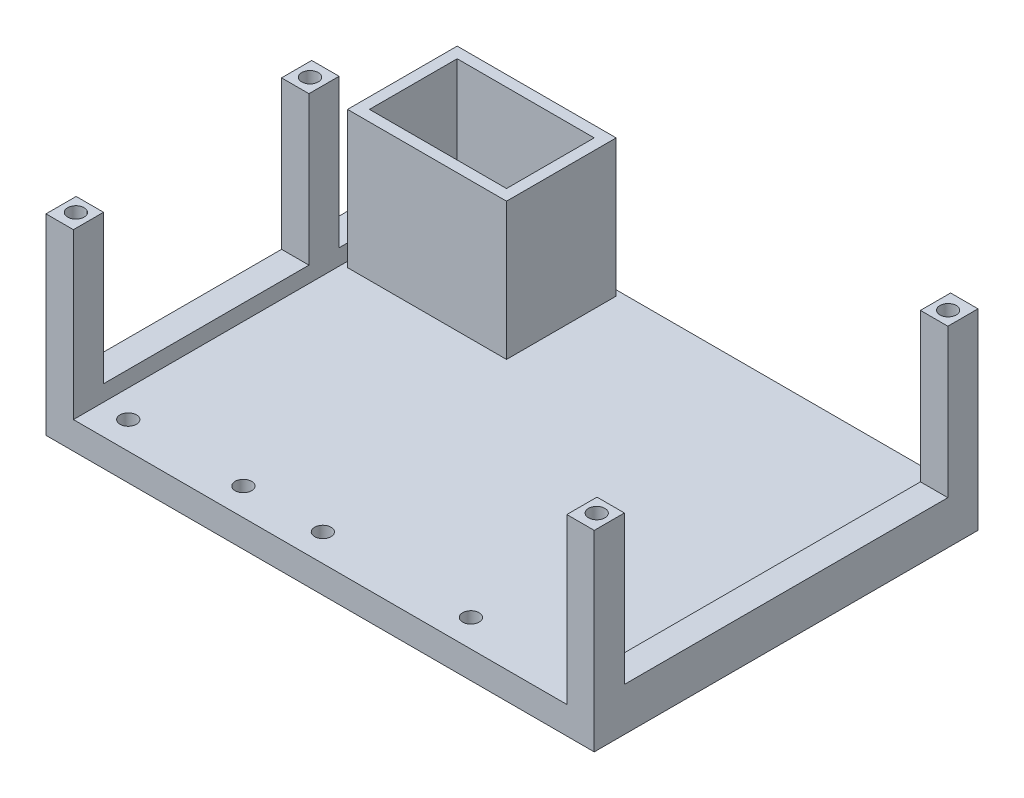
ISO-10303-21;
HEADER;
FILE_DESCRIPTION(('STEP AP214'),'2;1');
FILE_NAME('part.step','',(''),(''),'','','');
FILE_SCHEMA(('AUTOMOTIVE_DESIGN { 1 0 10303 214 1 1 1 1 }'));
ENDSEC;
DATA;
#1=APPLICATION_CONTEXT('core data for automotive mechanical design processes');
#2=APPLICATION_PROTOCOL_DEFINITION('international standard','automotive_design',2000,#1);
#3=PRODUCT_CONTEXT('',#1,'mechanical');
#4=PRODUCT('Part','Part','',(#3));
#5=PRODUCT_RELATED_PRODUCT_CATEGORY('part','',(#4));
#6=PRODUCT_DEFINITION_FORMATION('','',#4);
#7=PRODUCT_DEFINITION_CONTEXT('part definition',#1,'design');
#8=PRODUCT_DEFINITION('design','',#6,#7);
#9=PRODUCT_DEFINITION_SHAPE('','',#8);
#10=(LENGTH_UNIT() NAMED_UNIT(*) SI_UNIT(.MILLI.,.METRE.));
#11=(NAMED_UNIT(*) PLANE_ANGLE_UNIT() SI_UNIT($,.RADIAN.));
#12=(NAMED_UNIT(*) SI_UNIT($,.STERADIAN.) SOLID_ANGLE_UNIT());
#13=UNCERTAINTY_MEASURE_WITH_UNIT(LENGTH_MEASURE(1.E-05),#10,'distance_accuracy_value','');
#14=(GEOMETRIC_REPRESENTATION_CONTEXT(3) GLOBAL_UNCERTAINTY_ASSIGNED_CONTEXT((#13)) GLOBAL_UNIT_ASSIGNED_CONTEXT((#10,
#11,#12)) REPRESENTATION_CONTEXT('',''));
#15=CARTESIAN_POINT('',(0.,0.,0.));
#16=DIRECTION('',(0.,0.,1.));
#17=DIRECTION('',(1.,0.,0.));
#18=AXIS2_PLACEMENT_3D('',#15,#16,#17);
#19=CARTESIAN_POINT('',(0.,32.,0.));
#20=DIRECTION('',(0.,-1.,0.));
#21=DIRECTION('',(0.,0.,-1.));
#22=AXIS2_PLACEMENT_3D('',#19,#20,#21);
#23=PLANE('',#22);
#24=CARTESIAN_POINT('',(-47.5,32.,32.0490066170492));
#25=DIRECTION('',(0.,1.,0.));
#26=DIRECTION('',(0.,0.,1.));
#27=AXIS2_PLACEMENT_3D('',#24,#25,#26);
#28=CIRCLE('',#27,1.5);
#29=CARTESIAN_POINT('',(-47.5,32.,33.5490066170492));
#30=VERTEX_POINT('',#29);
#31=EDGE_CURVE('E380',#30,#30,#28,.T.);
#32=ORIENTED_EDGE('',*,*,#31,.F.);
#33=EDGE_LOOP('',(#32));
#34=FACE_BOUND('',#33,.T.);
#35=DIRECTION('',(0.,0.,-1.));
#36=VECTOR('',#35,1.);
#37=CARTESIAN_POINT('',(-45.,32.,-35.));
#38=LINE('',#37,#36);
#39=CARTESIAN_POINT('',(-45.,32.,35.));
#40=VERTEX_POINT('',#39);
#41=CARTESIAN_POINT('',(-45.,32.,29.5));
#42=VERTEX_POINT('',#41);
#43=EDGE_CURVE('E405',#40,#42,#38,.T.);
#44=ORIENTED_EDGE('',*,*,#43,.T.);
#45=DIRECTION('',(-1.,0.,0.));
#46=VECTOR('',#45,1.);
#47=CARTESIAN_POINT('',(0.,32.,29.5));
#48=LINE('',#47,#46);
#49=CARTESIAN_POINT('',(-50.,32.,29.5));
#50=VERTEX_POINT('',#49);
#51=EDGE_CURVE('E11',#42,#50,#48,.T.);
#52=ORIENTED_EDGE('',*,*,#51,.T.);
#53=DIRECTION('',(0.,0.,1.));
#54=VECTOR('',#53,1.);
#55=CARTESIAN_POINT('',(-50.,32.,-35.));
#56=LINE('',#55,#54);
#57=CARTESIAN_POINT('',(-50.,32.,35.));
#58=VERTEX_POINT('',#57);
#59=EDGE_CURVE('E408',#50,#58,#56,.T.);
#60=ORIENTED_EDGE('',*,*,#59,.T.);
#61=DIRECTION('',(1.,0.,0.));
#62=VECTOR('',#61,1.);
#63=CARTESIAN_POINT('',(-45.,32.,35.));
#64=LINE('',#63,#62);
#65=EDGE_CURVE('E412',#58,#40,#64,.T.);
#66=ORIENTED_EDGE('',*,*,#65,.T.);
#67=EDGE_LOOP('',(#44,#52,#60,#66));
#68=FACE_BOUND('',#67,.T.);
#69=ADVANCED_FACE('F39',(#34,#68),#23,.F.);
#70=CARTESIAN_POINT('',(0.,2.,0.));
#71=DIRECTION('',(0.,1.,0.));
#72=DIRECTION('',(0.,0.,1.));
#73=AXIS2_PLACEMENT_3D('',#70,#71,#72);
#74=PLANE('',#73);
#75=CARTESIAN_POINT('',(-40.,2.,30.));
#76=DIRECTION('',(0.,1.,0.));
#77=DIRECTION('',(0.,0.,1.));
#78=AXIS2_PLACEMENT_3D('',#75,#76,#77);
#79=CIRCLE('',#78,1.5);
#80=CARTESIAN_POINT('',(-40.,2.,31.5));
#81=VERTEX_POINT('',#80);
#82=EDGE_CURVE('E429',#81,#81,#79,.T.);
#83=ORIENTED_EDGE('',*,*,#82,.F.);
#84=EDGE_LOOP('',(#83));
#85=FACE_BOUND('',#84,.T.);
#86=CARTESIAN_POINT('',(-19.,2.,30.));
#87=DIRECTION('',(0.,1.,0.));
#88=DIRECTION('',(0.,0.,1.));
#89=AXIS2_PLACEMENT_3D('',#86,#87,#88);
#90=CIRCLE('',#89,1.5);
#91=CARTESIAN_POINT('',(-19.,2.,31.5));
#92=VERTEX_POINT('',#91);
#93=EDGE_CURVE('E432',#92,#92,#90,.T.);
#94=ORIENTED_EDGE('',*,*,#93,.F.);
#95=EDGE_LOOP('',(#94));
#96=FACE_BOUND('',#95,.T.);
#97=CARTESIAN_POINT('',(-4.49999999999999,2.,30.));
#98=DIRECTION('',(0.,1.,0.));
#99=DIRECTION('',(0.,0.,1.));
#100=AXIS2_PLACEMENT_3D('',#97,#98,#99);
#101=CIRCLE('',#100,1.5);
#102=CARTESIAN_POINT('',(-4.49999999999999,2.,31.5));
#103=VERTEX_POINT('',#102);
#104=EDGE_CURVE('E438',#103,#103,#101,.T.);
#105=ORIENTED_EDGE('',*,*,#104,.F.);
#106=EDGE_LOOP('',(#105));
#107=FACE_BOUND('',#106,.T.);
#108=CARTESIAN_POINT('',(22.5,2.,30.));
#109=DIRECTION('',(0.,1.,0.));
#110=DIRECTION('',(0.,0.,1.));
#111=AXIS2_PLACEMENT_3D('',#108,#109,#110);
#112=CIRCLE('',#111,1.5);
#113=CARTESIAN_POINT('',(22.5,2.,31.5));
#114=VERTEX_POINT('',#113);
#115=EDGE_CURVE('E444',#114,#114,#112,.T.);
#116=ORIENTED_EDGE('',*,*,#115,.F.);
#117=EDGE_LOOP('',(#116));
#118=FACE_BOUND('',#117,.T.);
#119=DIRECTION('',(1.,0.,0.));
#120=VECTOR('',#119,1.);
#121=CARTESIAN_POINT('',(-45.,2.,35.));
#122=LINE('',#121,#120);
#123=CARTESIAN_POINT('',(-45.,2.,35.));
#124=VERTEX_POINT('',#123);
#125=CARTESIAN_POINT('',(45.,2.,35.));
#126=VERTEX_POINT('',#125);
#127=EDGE_CURVE('E452',#124,#126,#122,.T.);
#128=ORIENTED_EDGE('',*,*,#127,.T.);
#129=DIRECTION('',(0.,0.,1.));
#130=VECTOR('',#129,1.);
#131=CARTESIAN_POINT('',(45.,2.,-35.));
#132=LINE('',#131,#130);
#133=CARTESIAN_POINT('',(45.,2.,-35.));
#134=VERTEX_POINT('',#133);
#135=EDGE_CURVE('E383',#134,#126,#132,.T.);
#136=ORIENTED_EDGE('',*,*,#135,.F.);
#137=DIRECTION('',(-1.,0.,0.));
#138=VECTOR('',#137,1.);
#139=CARTESIAN_POINT('',(-45.,2.,-35.));
#140=LINE('',#139,#138);
#141=CARTESIAN_POINT('',(-45.,2.,-35.));
#142=VERTEX_POINT('',#141);
#143=EDGE_CURVE('E225',#134,#142,#140,.T.);
#144=ORIENTED_EDGE('',*,*,#143,.T.);
#145=DIRECTION('',(0.,0.,-1.));
#146=VECTOR('',#145,1.);
#147=CARTESIAN_POINT('',(-45.,2.,-35.));
#148=LINE('',#147,#146);
#149=EDGE_CURVE('E404',#124,#142,#148,.T.);
#150=ORIENTED_EDGE('',*,*,#149,.F.);
#151=EDGE_LOOP('',(#128,#136,#144,#150));
#152=FACE_BOUND('',#151,.T.);
#153=DIRECTION('',(0.,0.,1.));
#154=VECTOR('',#153,1.);
#155=CARTESIAN_POINT('',(-44.,2.,0.));
#156=LINE('',#155,#154);
#157=CARTESIAN_POINT('',(-44.,2.,-34.));
#158=VERTEX_POINT('',#157);
#159=CARTESIAN_POINT('',(-44.,2.,-14.));
#160=VERTEX_POINT('',#159);
#161=EDGE_CURVE('E332',#158,#160,#156,.T.);
#162=ORIENTED_EDGE('',*,*,#161,.F.);
#163=DIRECTION('',(-1.,0.,0.));
#164=VECTOR('',#163,1.);
#165=CARTESIAN_POINT('',(0.,2.,-34.));
#166=LINE('',#165,#164);
#167=CARTESIAN_POINT('',(-15.,2.,-34.));
#168=VERTEX_POINT('',#167);
#169=EDGE_CURVE('E312',#168,#158,#166,.T.);
#170=ORIENTED_EDGE('',*,*,#169,.F.);
#171=DIRECTION('',(0.,0.,-1.));
#172=VECTOR('',#171,1.);
#173=CARTESIAN_POINT('',(-15.,2.,0.));
#174=LINE('',#173,#172);
#175=CARTESIAN_POINT('',(-15.,2.,-14.));
#176=VERTEX_POINT('',#175);
#177=EDGE_CURVE('E323',#176,#168,#174,.T.);
#178=ORIENTED_EDGE('',*,*,#177,.F.);
#179=DIRECTION('',(1.,0.,0.));
#180=VECTOR('',#179,1.);
#181=CARTESIAN_POINT('',(0.,2.,-14.));
#182=LINE('',#181,#180);
#183=EDGE_CURVE('E334',#160,#176,#182,.T.);
#184=ORIENTED_EDGE('',*,*,#183,.F.);
#185=EDGE_LOOP('',(#162,#170,#178,#184));
#186=FACE_BOUND('',#185,.T.);
#187=ADVANCED_FACE('F495',(#85,#96,#107,#118,#152,#186),#74,.T.);
#188=CARTESIAN_POINT('',(50.,0.,-35.));
#189=DIRECTION('',(1.,0.,0.));
#190=DIRECTION('',(0.,0.,-1.));
#191=AXIS2_PLACEMENT_3D('',#188,#189,#190);
#192=PLANE('',#191);
#193=DIRECTION('',(0.,0.,1.));
#194=VECTOR('',#193,1.);
#195=CARTESIAN_POINT('',(50.,4.91267187609612,-35.));
#196=LINE('',#195,#194);
#197=CARTESIAN_POINT('',(50.,4.91267187609612,-29.5));
#198=VERTEX_POINT('',#197);
#199=CARTESIAN_POINT('',(50.,4.91267187609612,29.5));
#200=VERTEX_POINT('',#199);
#201=EDGE_CURVE('E362',#198,#200,#196,.T.);
#202=ORIENTED_EDGE('',*,*,#201,.T.);
#203=DIRECTION('',(0.,1.,0.));
#204=VECTOR('',#203,1.);
#205=CARTESIAN_POINT('',(50.,0.,29.5));
#206=LINE('',#205,#204);
#207=CARTESIAN_POINT('',(50.,32.,29.5));
#208=VERTEX_POINT('',#207);
#209=EDGE_CURVE('E360',#200,#208,#206,.T.);
#210=ORIENTED_EDGE('',*,*,#209,.T.);
#211=DIRECTION('',(0.,0.,-1.));
#212=VECTOR('',#211,1.);
#213=CARTESIAN_POINT('',(50.,32.,-35.));
#214=LINE('',#213,#212);
#215=CARTESIAN_POINT('',(50.,32.,35.));
#216=VERTEX_POINT('',#215);
#217=EDGE_CURVE('E237',#216,#208,#214,.T.);
#218=ORIENTED_EDGE('',*,*,#217,.F.);
#219=DIRECTION('',(0.,1.,0.));
#220=VECTOR('',#219,1.);
#221=CARTESIAN_POINT('',(50.,0.,35.));
#222=LINE('',#221,#220);
#223=CARTESIAN_POINT('',(50.,-3.,35.));
#224=VERTEX_POINT('',#223);
#225=EDGE_CURVE('E216',#224,#216,#222,.T.);
#226=ORIENTED_EDGE('',*,*,#225,.F.);
#227=DIRECTION('',(0.,0.,1.));
#228=VECTOR('',#227,1.);
#229=CARTESIAN_POINT('',(50.,-3.,0.));
#230=LINE('',#229,#228);
#231=CARTESIAN_POINT('',(50.,-3.,-35.));
#232=VERTEX_POINT('',#231);
#233=EDGE_CURVE('E234',#232,#224,#230,.T.);
#234=ORIENTED_EDGE('',*,*,#233,.F.);
#235=DIRECTION('',(0.,1.,0.));
#236=VECTOR('',#235,1.);
#237=CARTESIAN_POINT('',(50.,0.,-35.));
#238=LINE('',#237,#236);
#239=CARTESIAN_POINT('',(50.,32.,-35.));
#240=VERTEX_POINT('',#239);
#241=EDGE_CURVE('E239',#232,#240,#238,.T.);
#242=ORIENTED_EDGE('',*,*,#241,.T.);
#243=CARTESIAN_POINT('',(50.,32.,-29.5));
#244=VERTEX_POINT('',#243);
#245=EDGE_CURVE('E392',#244,#240,#214,.T.);
#246=ORIENTED_EDGE('',*,*,#245,.F.);
#247=DIRECTION('',(0.,-1.,0.));
#248=VECTOR('',#247,1.);
#249=CARTESIAN_POINT('',(50.,0.,-29.5));
#250=LINE('',#249,#248);
#251=EDGE_CURVE('E355',#244,#198,#250,.T.);
#252=ORIENTED_EDGE('',*,*,#251,.T.);
#253=EDGE_LOOP('',(#202,#210,#218,#226,#234,#242,#246,#252));
#254=FACE_BOUND('',#253,.T.);
#255=ADVANCED_FACE('F232',(#254),#192,.T.);
#256=CARTESIAN_POINT('',(45.,32.,-35.));
#257=DIRECTION('',(1.,0.,0.));
#258=DIRECTION('',(0.,0.,-1.));
#259=AXIS2_PLACEMENT_3D('',#256,#257,#258);
#260=PLANE('',#259);
#261=DIRECTION('',(0.,1.,0.));
#262=VECTOR('',#261,1.);
#263=CARTESIAN_POINT('',(45.,32.,29.5));
#264=LINE('',#263,#262);
#265=CARTESIAN_POINT('',(45.,4.91267187609612,29.5));
#266=VERTEX_POINT('',#265);
#267=CARTESIAN_POINT('',(45.,32.,29.5));
#268=VERTEX_POINT('',#267);
#269=EDGE_CURVE('E358',#266,#268,#264,.T.);
#270=ORIENTED_EDGE('',*,*,#269,.F.);
#271=DIRECTION('',(0.,0.,1.));
#272=VECTOR('',#271,1.);
#273=CARTESIAN_POINT('',(45.,4.91267187609612,-35.));
#274=LINE('',#273,#272);
#275=CARTESIAN_POINT('',(45.,4.91267187609612,-29.5));
#276=VERTEX_POINT('',#275);
#277=EDGE_CURVE('E460',#276,#266,#274,.T.);
#278=ORIENTED_EDGE('',*,*,#277,.F.);
#279=DIRECTION('',(0.,-1.,0.));
#280=VECTOR('',#279,1.);
#281=CARTESIAN_POINT('',(45.,32.,-29.5));
#282=LINE('',#281,#280);
#283=CARTESIAN_POINT('',(45.,32.,-29.5));
#284=VERTEX_POINT('',#283);
#285=EDGE_CURVE('E353',#284,#276,#282,.T.);
#286=ORIENTED_EDGE('',*,*,#285,.F.);
#287=DIRECTION('',(0.,0.,1.));
#288=VECTOR('',#287,1.);
#289=CARTESIAN_POINT('',(45.,32.,-35.));
#290=LINE('',#289,#288);
#291=CARTESIAN_POINT('',(45.,32.,-35.));
#292=VERTEX_POINT('',#291);
#293=EDGE_CURVE('E386',#292,#284,#290,.T.);
#294=ORIENTED_EDGE('',*,*,#293,.F.);
#295=DIRECTION('',(0.,-1.,0.));
#296=VECTOR('',#295,1.);
#297=CARTESIAN_POINT('',(45.,32.,-35.));
#298=LINE('',#297,#296);
#299=EDGE_CURVE('E396',#292,#134,#298,.T.);
#300=ORIENTED_EDGE('',*,*,#299,.T.);
#301=ORIENTED_EDGE('',*,*,#135,.T.);
#302=DIRECTION('',(0.,-1.,0.));
#303=VECTOR('',#302,1.);
#304=CARTESIAN_POINT('',(45.,32.,35.));
#305=LINE('',#304,#303);
#306=CARTESIAN_POINT('',(45.,32.,35.));
#307=VERTEX_POINT('',#306);
#308=EDGE_CURVE('E401',#307,#126,#305,.T.);
#309=ORIENTED_EDGE('',*,*,#308,.F.);
#310=EDGE_CURVE('E390',#268,#307,#290,.T.);
#311=ORIENTED_EDGE('',*,*,#310,.F.);
#312=EDGE_LOOP('',(#270,#278,#286,#294,#300,#301,#309,#311));
#313=FACE_BOUND('',#312,.T.);
#314=ADVANCED_FACE('F504',(#313),#260,.F.);
#315=CARTESIAN_POINT('',(0.,32.,0.));
#316=DIRECTION('',(0.,1.,0.));
#317=DIRECTION('',(0.,0.,1.));
#318=AXIS2_PLACEMENT_3D('',#315,#316,#317);
#319=PLANE('',#318);
#320=CARTESIAN_POINT('',(47.5,32.,32.0490066170492));
#321=DIRECTION('',(0.,1.,0.));
#322=DIRECTION('',(0.,0.,-1.));
#323=AXIS2_PLACEMENT_3D('',#320,#321,#322);
#324=CIRCLE('',#323,1.5);
#325=CARTESIAN_POINT('',(47.5,32.,30.5490066170492));
#326=VERTEX_POINT('',#325);
#327=EDGE_CURVE('E364',#326,#326,#324,.T.);
#328=ORIENTED_EDGE('',*,*,#327,.F.);
#329=EDGE_LOOP('',(#328));
#330=FACE_BOUND('',#329,.T.);
#331=ORIENTED_EDGE('',*,*,#217,.T.);
#332=DIRECTION('',(-1.,0.,0.));
#333=VECTOR('',#332,1.);
#334=CARTESIAN_POINT('',(0.,32.,29.5));
#335=LINE('',#334,#333);
#336=EDGE_CURVE('E457',#208,#268,#335,.T.);
#337=ORIENTED_EDGE('',*,*,#336,.T.);
#338=ORIENTED_EDGE('',*,*,#310,.T.);
#339=DIRECTION('',(1.,0.,0.));
#340=VECTOR('',#339,1.);
#341=CARTESIAN_POINT('',(45.,32.,35.));
#342=LINE('',#341,#340);
#343=EDGE_CURVE('E389',#307,#216,#342,.T.);
#344=ORIENTED_EDGE('',*,*,#343,.T.);
#345=EDGE_LOOP('',(#331,#337,#338,#344));
#346=FACE_BOUND('',#345,.T.);
#347=ADVANCED_FACE('F522',(#330,#346),#319,.T.);
#348=CARTESIAN_POINT('',(47.5,32.,-32.0490066170492));
#349=DIRECTION('',(0.,1.,0.));
#350=DIRECTION('',(0.,0.,1.));
#351=AXIS2_PLACEMENT_3D('',#348,#349,#350);
#352=CIRCLE('',#351,1.5);
#353=CARTESIAN_POINT('',(47.5,32.,-30.5490066170492));
#354=VERTEX_POINT('',#353);
#355=EDGE_CURVE('E372',#354,#354,#352,.T.);
#356=ORIENTED_EDGE('',*,*,#355,.F.);
#357=EDGE_LOOP('',(#356));
#358=FACE_BOUND('',#357,.T.);
#359=ORIENTED_EDGE('',*,*,#293,.T.);
#360=DIRECTION('',(1.,0.,0.));
#361=VECTOR('',#360,1.);
#362=CARTESIAN_POINT('',(0.,32.,-29.5));
#363=LINE('',#362,#361);
#364=EDGE_CURVE('E454',#284,#244,#363,.T.);
#365=ORIENTED_EDGE('',*,*,#364,.T.);
#366=ORIENTED_EDGE('',*,*,#245,.T.);
#367=DIRECTION('',(-1.,0.,0.));
#368=VECTOR('',#367,1.);
#369=CARTESIAN_POINT('',(45.,32.,-35.));
#370=LINE('',#369,#368);
#371=EDGE_CURVE('E394',#240,#292,#370,.T.);
#372=ORIENTED_EDGE('',*,*,#371,.T.);
#373=EDGE_LOOP('',(#359,#365,#366,#372));
#374=FACE_BOUND('',#373,.T.);
#375=ADVANCED_FACE('F509',(#358,#374),#319,.T.);
#376=CARTESIAN_POINT('',(-45.,2.,-35.));
#377=DIRECTION('',(0.,0.,1.));
#378=DIRECTION('',(1.,0.,0.));
#379=AXIS2_PLACEMENT_3D('',#376,#377,#378);
#380=PLANE('',#379);
#381=ORIENTED_EDGE('',*,*,#241,.F.);
#382=DIRECTION('',(-1.,0.,0.));
#383=VECTOR('',#382,1.);
#384=CARTESIAN_POINT('',(-45.,-3.,-35.));
#385=LINE('',#384,#383);
#386=CARTESIAN_POINT('',(-50.,-3.,-35.));
#387=VERTEX_POINT('',#386);
#388=EDGE_CURVE('E226',#232,#387,#385,.T.);
#389=ORIENTED_EDGE('',*,*,#388,.T.);
#390=DIRECTION('',(0.,1.,0.));
#391=VECTOR('',#390,1.);
#392=CARTESIAN_POINT('',(-50.,0.,-35.));
#393=LINE('',#392,#391);
#394=CARTESIAN_POINT('',(-50.,4.91267187609611,-35.));
#395=VERTEX_POINT('',#394);
#396=EDGE_CURVE('E238',#387,#395,#393,.T.);
#397=ORIENTED_EDGE('',*,*,#396,.T.);
#398=DIRECTION('',(1.,0.,0.));
#399=VECTOR('',#398,1.);
#400=CARTESIAN_POINT('',(-70.,4.91267187609611,-35.));
#401=LINE('',#400,#399);
#402=CARTESIAN_POINT('',(-45.,4.91267187609611,-35.));
#403=VERTEX_POINT('',#402);
#404=EDGE_CURVE('E261',#395,#403,#401,.T.);
#405=ORIENTED_EDGE('',*,*,#404,.T.);
#406=DIRECTION('',(0.,-1.,0.));
#407=VECTOR('',#406,1.);
#408=CARTESIAN_POINT('',(-45.,32.,-35.));
#409=LINE('',#408,#407);
#410=EDGE_CURVE('E419',#403,#142,#409,.T.);
#411=ORIENTED_EDGE('',*,*,#410,.T.);
#412=ORIENTED_EDGE('',*,*,#143,.F.);
#413=ORIENTED_EDGE('',*,*,#299,.F.);
#414=ORIENTED_EDGE('',*,*,#371,.F.);
#415=EDGE_LOOP('',(#381,#389,#397,#405,#411,#412,#413,#414));
#416=FACE_BOUND('',#415,.T.);
#417=ADVANCED_FACE('F41',(#416),#380,.F.);
#418=CARTESIAN_POINT('',(-45.,2.,35.));
#419=DIRECTION('',(0.,0.,-1.));
#420=DIRECTION('',(-1.,0.,0.));
#421=AXIS2_PLACEMENT_3D('',#418,#419,#420);
#422=PLANE('',#421);
#423=DIRECTION('',(1.,0.,0.));
#424=VECTOR('',#423,1.);
#425=CARTESIAN_POINT('',(-45.,-3.,35.));
#426=LINE('',#425,#424);
#427=CARTESIAN_POINT('',(-50.,-3.,35.));
#428=VERTEX_POINT('',#427);
#429=EDGE_CURVE('E212',#428,#224,#426,.T.);
#430=ORIENTED_EDGE('',*,*,#429,.T.);
#431=ORIENTED_EDGE('',*,*,#225,.T.);
#432=ORIENTED_EDGE('',*,*,#343,.F.);
#433=ORIENTED_EDGE('',*,*,#308,.T.);
#434=ORIENTED_EDGE('',*,*,#127,.F.);
#435=DIRECTION('',(0.,-1.,0.));
#436=VECTOR('',#435,1.);
#437=CARTESIAN_POINT('',(-45.,32.,35.));
#438=LINE('',#437,#436);
#439=EDGE_CURVE('E414',#40,#124,#438,.T.);
#440=ORIENTED_EDGE('',*,*,#439,.F.);
#441=ORIENTED_EDGE('',*,*,#65,.F.);
#442=DIRECTION('',(0.,1.,0.));
#443=VECTOR('',#442,1.);
#444=CARTESIAN_POINT('',(-50.,0.,35.));
#445=LINE('',#444,#443);
#446=EDGE_CURVE('E220',#428,#58,#445,.T.);
#447=ORIENTED_EDGE('',*,*,#446,.F.);
#448=EDGE_LOOP('',(#430,#431,#432,#433,#434,#440,#441,#447));
#449=FACE_BOUND('',#448,.T.);
#450=ADVANCED_FACE('F214',(#449),#422,.F.);
#451=CARTESIAN_POINT('',(0.,-3.,0.));
#452=DIRECTION('',(0.,1.,0.));
#453=DIRECTION('',(0.,0.,1.));
#454=AXIS2_PLACEMENT_3D('',#451,#452,#453);
#455=PLANE('',#454);
#456=CARTESIAN_POINT('',(-40.,-3.,30.));
#457=DIRECTION('',(0.,1.,0.));
#458=DIRECTION('',(0.,0.,1.));
#459=AXIS2_PLACEMENT_3D('',#456,#457,#458);
#460=CIRCLE('',#459,1.5);
#461=CARTESIAN_POINT('',(-40.,-3.,31.5));
#462=VERTEX_POINT('',#461);
#463=EDGE_CURVE('E426',#462,#462,#460,.T.);
#464=ORIENTED_EDGE('',*,*,#463,.T.);
#465=EDGE_LOOP('',(#464));
#466=FACE_BOUND('',#465,.T.);
#467=CARTESIAN_POINT('',(-19.,-3.,30.));
#468=DIRECTION('',(0.,1.,0.));
#469=DIRECTION('',(0.,0.,1.));
#470=AXIS2_PLACEMENT_3D('',#467,#468,#469);
#471=CIRCLE('',#470,1.5);
#472=CARTESIAN_POINT('',(-19.,-3.,31.5));
#473=VERTEX_POINT('',#472);
#474=EDGE_CURVE('E435',#473,#473,#471,.T.);
#475=ORIENTED_EDGE('',*,*,#474,.T.);
#476=EDGE_LOOP('',(#475));
#477=FACE_BOUND('',#476,.T.);
#478=CARTESIAN_POINT('',(-4.49999999999999,-3.,30.));
#479=DIRECTION('',(0.,1.,0.));
#480=DIRECTION('',(0.,0.,1.));
#481=AXIS2_PLACEMENT_3D('',#478,#479,#480);
#482=CIRCLE('',#481,1.5);
#483=CARTESIAN_POINT('',(-4.49999999999999,-3.,31.5));
#484=VERTEX_POINT('',#483);
#485=EDGE_CURVE('E441',#484,#484,#482,.T.);
#486=ORIENTED_EDGE('',*,*,#485,.T.);
#487=EDGE_LOOP('',(#486));
#488=FACE_BOUND('',#487,.T.);
#489=CARTESIAN_POINT('',(22.5,-3.,30.));
#490=DIRECTION('',(0.,1.,0.));
#491=DIRECTION('',(0.,0.,1.));
#492=AXIS2_PLACEMENT_3D('',#489,#490,#491);
#493=CIRCLE('',#492,1.5);
#494=CARTESIAN_POINT('',(22.5,-3.,31.5));
#495=VERTEX_POINT('',#494);
#496=EDGE_CURVE('E423',#495,#495,#493,.T.);
#497=ORIENTED_EDGE('',*,*,#496,.T.);
#498=EDGE_LOOP('',(#497));
#499=FACE_BOUND('',#498,.T.);
#500=ORIENTED_EDGE('',*,*,#388,.F.);
#501=ORIENTED_EDGE('',*,*,#233,.T.);
#502=ORIENTED_EDGE('',*,*,#429,.F.);
#503=DIRECTION('',(0.,0.,-1.));
#504=VECTOR('',#503,1.);
#505=CARTESIAN_POINT('',(-50.,-3.,0.));
#506=LINE('',#505,#504);
#507=EDGE_CURVE('E243',#428,#387,#506,.T.);
#508=ORIENTED_EDGE('',*,*,#507,.T.);
#509=EDGE_LOOP('',(#500,#501,#502,#508));
#510=FACE_BOUND('',#509,.T.);
#511=ADVANCED_FACE('F241',(#466,#477,#488,#499,#510),#455,.F.);
#512=CARTESIAN_POINT('',(22.5,-3.,30.));
#513=DIRECTION('',(0.,1.,0.));
#514=DIRECTION('',(0.,0.,1.));
#515=AXIS2_PLACEMENT_3D('',#512,#513,#514);
#516=CYLINDRICAL_SURFACE('',#515,1.5);
#517=ORIENTED_EDGE('',*,*,#496,.F.);
#518=EDGE_LOOP('',(#517));
#519=FACE_BOUND('',#518,.T.);
#520=ORIENTED_EDGE('',*,*,#115,.T.);
#521=EDGE_LOOP('',(#520));
#522=FACE_BOUND('',#521,.T.);
#523=ADVANCED_FACE('F801',(#519,#522),#516,.F.);
#524=CARTESIAN_POINT('',(-4.49999999999999,-3.,30.));
#525=DIRECTION('',(0.,1.,0.));
#526=DIRECTION('',(0.,0.,1.));
#527=AXIS2_PLACEMENT_3D('',#524,#525,#526);
#528=CYLINDRICAL_SURFACE('',#527,1.5);
#529=ORIENTED_EDGE('',*,*,#485,.F.);
#530=EDGE_LOOP('',(#529));
#531=FACE_BOUND('',#530,.T.);
#532=ORIENTED_EDGE('',*,*,#104,.T.);
#533=EDGE_LOOP('',(#532));
#534=FACE_BOUND('',#533,.T.);
#535=ADVANCED_FACE('F996',(#531,#534),#528,.F.);
#536=CARTESIAN_POINT('',(-19.,-3.,30.));
#537=DIRECTION('',(0.,1.,0.));
#538=DIRECTION('',(0.,0.,1.));
#539=AXIS2_PLACEMENT_3D('',#536,#537,#538);
#540=CYLINDRICAL_SURFACE('',#539,1.5);
#541=ORIENTED_EDGE('',*,*,#474,.F.);
#542=EDGE_LOOP('',(#541));
#543=FACE_BOUND('',#542,.T.);
#544=ORIENTED_EDGE('',*,*,#93,.T.);
#545=EDGE_LOOP('',(#544));
#546=FACE_BOUND('',#545,.T.);
#547=ADVANCED_FACE('F987',(#543,#546),#540,.F.);
#548=CARTESIAN_POINT('',(-40.,-3.,30.));
#549=DIRECTION('',(0.,1.,0.));
#550=DIRECTION('',(0.,0.,1.));
#551=AXIS2_PLACEMENT_3D('',#548,#549,#550);
#552=CYLINDRICAL_SURFACE('',#551,1.5);
#553=ORIENTED_EDGE('',*,*,#463,.F.);
#554=EDGE_LOOP('',(#553));
#555=FACE_BOUND('',#554,.T.);
#556=ORIENTED_EDGE('',*,*,#82,.T.);
#557=EDGE_LOOP('',(#556));
#558=FACE_BOUND('',#557,.T.);
#559=ADVANCED_FACE('F811',(#555,#558),#552,.F.);
#560=CARTESIAN_POINT('',(-50.,0.,-35.));
#561=DIRECTION('',(-1.,0.,0.));
#562=DIRECTION('',(0.,0.,1.));
#563=AXIS2_PLACEMENT_3D('',#560,#561,#562);
#564=PLANE('',#563);
#565=DIRECTION('',(0.,0.,1.));
#566=VECTOR('',#565,1.);
#567=CARTESIAN_POINT('',(-50.,4.91267187609611,-35.));
#568=LINE('',#567,#566);
#569=CARTESIAN_POINT('',(-50.,4.91267187609612,-13.4643245110871));
#570=VERTEX_POINT('',#569);
#571=EDGE_CURVE('E277',#395,#570,#568,.T.);
#572=ORIENTED_EDGE('',*,*,#571,.F.);
#573=ORIENTED_EDGE('',*,*,#396,.F.);
#574=ORIENTED_EDGE('',*,*,#507,.F.);
#575=ORIENTED_EDGE('',*,*,#446,.T.);
#576=ORIENTED_EDGE('',*,*,#59,.F.);
#577=DIRECTION('',(0.,1.,0.));
#578=VECTOR('',#577,1.);
#579=CARTESIAN_POINT('',(-50.,0.,29.5));
#580=LINE('',#579,#578);
#581=CARTESIAN_POINT('',(-50.,4.91267187609612,29.5));
#582=VERTEX_POINT('',#581);
#583=EDGE_CURVE('E281',#582,#50,#580,.T.);
#584=ORIENTED_EDGE('',*,*,#583,.F.);
#585=DIRECTION('',(0.,0.,1.));
#586=VECTOR('',#585,1.);
#587=CARTESIAN_POINT('',(-50.,4.91267187609611,-35.));
#588=LINE('',#587,#586);
#589=CARTESIAN_POINT('',(-50.,4.91267187609612,-7.96432451108711));
#590=VERTEX_POINT('',#589);
#591=EDGE_CURVE('E284',#590,#582,#588,.T.);
#592=ORIENTED_EDGE('',*,*,#591,.F.);
#593=DIRECTION('',(0.,-1.,0.));
#594=VECTOR('',#593,1.);
#595=CARTESIAN_POINT('',(-50.,0.,-7.96432451108711));
#596=LINE('',#595,#594);
#597=CARTESIAN_POINT('',(-50.,32.,-7.96432451108711));
#598=VERTEX_POINT('',#597);
#599=EDGE_CURVE('E279',#598,#590,#596,.T.);
#600=ORIENTED_EDGE('',*,*,#599,.F.);
#601=CARTESIAN_POINT('',(-50.,32.,-13.4643245110871));
#602=VERTEX_POINT('',#601);
#603=EDGE_CURVE('E411',#602,#598,#56,.T.);
#604=ORIENTED_EDGE('',*,*,#603,.F.);
#605=DIRECTION('',(0.,1.,0.));
#606=VECTOR('',#605,1.);
#607=CARTESIAN_POINT('',(-50.,0.,-13.4643245110871));
#608=LINE('',#607,#606);
#609=EDGE_CURVE('E54',#570,#602,#608,.T.);
#610=ORIENTED_EDGE('',*,*,#609,.F.);
#611=EDGE_LOOP('',(#572,#573,#574,#575,#576,#584,#592,#600,#604,#610));
#612=FACE_BOUND('',#611,.T.);
#613=ADVANCED_FACE('F479',(#612),#564,.T.);
#614=CARTESIAN_POINT('',(-45.,32.,-35.));
#615=DIRECTION('',(-1.,0.,0.));
#616=DIRECTION('',(0.,0.,1.));
#617=AXIS2_PLACEMENT_3D('',#614,#615,#616);
#618=PLANE('',#617);
#619=ORIENTED_EDGE('',*,*,#410,.F.);
#620=DIRECTION('',(0.,0.,-1.));
#621=VECTOR('',#620,1.);
#622=CARTESIAN_POINT('',(-45.,4.91267187609611,-35.));
#623=LINE('',#622,#621);
#624=CARTESIAN_POINT('',(-45.,4.91267187609612,-13.4643245110871));
#625=VERTEX_POINT('',#624);
#626=EDGE_CURVE('E257',#625,#403,#623,.T.);
#627=ORIENTED_EDGE('',*,*,#626,.F.);
#628=DIRECTION('',(0.,-1.,0.));
#629=VECTOR('',#628,1.);
#630=CARTESIAN_POINT('',(-45.,32.,-13.4643245110871));
#631=LINE('',#630,#629);
#632=CARTESIAN_POINT('',(-45.,32.,-13.4643245110871));
#633=VERTEX_POINT('',#632);
#634=EDGE_CURVE('E254',#633,#625,#631,.T.);
#635=ORIENTED_EDGE('',*,*,#634,.F.);
#636=CARTESIAN_POINT('',(-45.,32.,-7.96432451108711));
#637=VERTEX_POINT('',#636);
#638=EDGE_CURVE('E409',#637,#633,#38,.T.);
#639=ORIENTED_EDGE('',*,*,#638,.F.);
#640=DIRECTION('',(0.,1.,0.));
#641=VECTOR('',#640,1.);
#642=CARTESIAN_POINT('',(-45.,32.,-7.96432451108711));
#643=LINE('',#642,#641);
#644=CARTESIAN_POINT('',(-45.,4.91267187609612,-7.96432451108711));
#645=VERTEX_POINT('',#644);
#646=EDGE_CURVE('E62',#645,#637,#643,.T.);
#647=ORIENTED_EDGE('',*,*,#646,.F.);
#648=DIRECTION('',(0.,0.,-1.));
#649=VECTOR('',#648,1.);
#650=CARTESIAN_POINT('',(-45.,4.91267187609612,29.5));
#651=LINE('',#650,#649);
#652=CARTESIAN_POINT('',(-45.,4.91267187609612,29.5));
#653=VERTEX_POINT('',#652);
#654=EDGE_CURVE('E272',#653,#645,#651,.T.);
#655=ORIENTED_EDGE('',*,*,#654,.F.);
#656=DIRECTION('',(0.,-1.,0.));
#657=VECTOR('',#656,1.);
#658=CARTESIAN_POINT('',(-45.,32.,29.5));
#659=LINE('',#658,#657);
#660=EDGE_CURVE('E258',#42,#653,#659,.T.);
#661=ORIENTED_EDGE('',*,*,#660,.F.);
#662=ORIENTED_EDGE('',*,*,#43,.F.);
#663=ORIENTED_EDGE('',*,*,#439,.T.);
#664=ORIENTED_EDGE('',*,*,#149,.T.);
#665=EDGE_LOOP('',(#619,#627,#635,#639,#647,#655,#661,#662,#663,#664));
#666=FACE_BOUND('',#665,.T.);
#667=ADVANCED_FACE('F473',(#666),#618,.F.);
#668=CARTESIAN_POINT('',(-47.5,32.,-10.6535769434023));
#669=DIRECTION('',(0.,1.,0.));
#670=DIRECTION('',(0.,0.,1.));
#671=AXIS2_PLACEMENT_3D('',#668,#669,#670);
#672=CIRCLE('',#671,1.5);
#673=CARTESIAN_POINT('',(-47.5,32.,-9.15357694340234));
#674=VERTEX_POINT('',#673);
#675=EDGE_CURVE('E245',#674,#674,#672,.T.);
#676=ORIENTED_EDGE('',*,*,#675,.F.);
#677=EDGE_LOOP('',(#676));
#678=FACE_BOUND('',#677,.T.);
#679=ORIENTED_EDGE('',*,*,#638,.T.);
#680=DIRECTION('',(1.,0.,0.));
#681=VECTOR('',#680,1.);
#682=CARTESIAN_POINT('',(-70.,32.,-13.4643245110871));
#683=LINE('',#682,#681);
#684=EDGE_CURVE('E260',#602,#633,#683,.T.);
#685=ORIENTED_EDGE('',*,*,#684,.F.);
#686=ORIENTED_EDGE('',*,*,#603,.T.);
#687=DIRECTION('',(1.,0.,0.));
#688=VECTOR('',#687,1.);
#689=CARTESIAN_POINT('',(0.,32.,-7.96432451108711));
#690=LINE('',#689,#688);
#691=EDGE_CURVE('E47',#598,#637,#690,.T.);
#692=ORIENTED_EDGE('',*,*,#691,.T.);
#693=EDGE_LOOP('',(#679,#685,#686,#692));
#694=FACE_BOUND('',#693,.T.);
#695=ADVANCED_FACE('F467',(#678,#694),#23,.F.);
#696=CARTESIAN_POINT('',(47.5,32.,-32.0490066170492));
#697=DIRECTION('',(0.,-1.,0.));
#698=DIRECTION('',(0.,0.,-1.));
#699=AXIS2_PLACEMENT_3D('',#696,#697,#698);
#700=CYLINDRICAL_SURFACE('',#699,1.5);
#701=ORIENTED_EDGE('',*,*,#355,.T.);
#702=EDGE_LOOP('',(#701));
#703=FACE_BOUND('',#702,.T.);
#704=CARTESIAN_POINT('',(47.5,2.,-32.0490066170492));
#705=DIRECTION('',(0.,1.,0.));
#706=DIRECTION('',(0.,0.,1.));
#707=AXIS2_PLACEMENT_3D('',#704,#705,#706);
#708=CIRCLE('',#707,1.5);
#709=CARTESIAN_POINT('',(47.5,2.,-30.5490066170492));
#710=VERTEX_POINT('',#709);
#711=EDGE_CURVE('E369',#710,#710,#708,.T.);
#712=ORIENTED_EDGE('',*,*,#711,.F.);
#713=EDGE_LOOP('',(#712));
#714=FACE_BOUND('',#713,.T.);
#715=ADVANCED_FACE('F545',(#703,#714),#700,.F.);
#716=CARTESIAN_POINT('',(47.5,2.,-32.0490066170492));
#717=DIRECTION('',(0.,1.,0.));
#718=DIRECTION('',(0.,0.,1.));
#719=AXIS2_PLACEMENT_3D('',#716,#717,#718);
#720=PLANE('',#719);
#721=ORIENTED_EDGE('',*,*,#711,.T.);
#722=EDGE_LOOP('',(#721));
#723=FACE_BOUND('',#722,.T.);
#724=ADVANCED_FACE('F551',(#723),#720,.T.);
#725=CARTESIAN_POINT('',(47.5,32.,32.0490066170492));
#726=DIRECTION('',(0.,-1.,0.));
#727=DIRECTION('',(0.,0.,-1.));
#728=AXIS2_PLACEMENT_3D('',#725,#726,#727);
#729=CYLINDRICAL_SURFACE('',#728,1.5);
#730=ORIENTED_EDGE('',*,*,#327,.T.);
#731=EDGE_LOOP('',(#730));
#732=FACE_BOUND('',#731,.T.);
#733=CARTESIAN_POINT('',(47.5,2.,32.0490066170492));
#734=DIRECTION('',(0.,1.,0.));
#735=DIRECTION('',(0.,0.,-1.));
#736=AXIS2_PLACEMENT_3D('',#733,#734,#735);
#737=CIRCLE('',#736,1.5);
#738=CARTESIAN_POINT('',(47.5,2.,30.5490066170492));
#739=VERTEX_POINT('',#738);
#740=EDGE_CURVE('E375',#739,#739,#737,.T.);
#741=ORIENTED_EDGE('',*,*,#740,.F.);
#742=EDGE_LOOP('',(#741));
#743=FACE_BOUND('',#742,.T.);
#744=ADVANCED_FACE('F638',(#732,#743),#729,.F.);
#745=CARTESIAN_POINT('',(47.5,2.,32.0490066170492));
#746=DIRECTION('',(0.,-1.,0.));
#747=DIRECTION('',(0.,0.,-1.));
#748=AXIS2_PLACEMENT_3D('',#745,#746,#747);
#749=PLANE('',#748);
#750=ORIENTED_EDGE('',*,*,#740,.T.);
#751=EDGE_LOOP('',(#750));
#752=FACE_BOUND('',#751,.T.);
#753=ADVANCED_FACE('F642',(#752),#749,.F.);
#754=CARTESIAN_POINT('',(-47.5,32.,32.0490066170492));
#755=DIRECTION('',(0.,-1.,0.));
#756=DIRECTION('',(0.,0.,-1.));
#757=AXIS2_PLACEMENT_3D('',#754,#755,#756);
#758=CYLINDRICAL_SURFACE('',#757,1.5);
#759=ORIENTED_EDGE('',*,*,#31,.T.);
#760=EDGE_LOOP('',(#759));
#761=FACE_BOUND('',#760,.T.);
#762=CARTESIAN_POINT('',(-47.5,2.,32.0490066170492));
#763=DIRECTION('',(0.,1.,0.));
#764=DIRECTION('',(0.,0.,1.));
#765=AXIS2_PLACEMENT_3D('',#762,#763,#764);
#766=CIRCLE('',#765,1.5);
#767=CARTESIAN_POINT('',(-47.5,2.,33.5490066170492));
#768=VERTEX_POINT('',#767);
#769=EDGE_CURVE('E368',#768,#768,#766,.T.);
#770=ORIENTED_EDGE('',*,*,#769,.F.);
#771=EDGE_LOOP('',(#770));
#772=FACE_BOUND('',#771,.T.);
#773=ADVANCED_FACE('F646',(#761,#772),#758,.F.);
#774=CARTESIAN_POINT('',(-47.5,2.,32.0490066170492));
#775=DIRECTION('',(0.,1.,0.));
#776=DIRECTION('',(0.,0.,1.));
#777=AXIS2_PLACEMENT_3D('',#774,#775,#776);
#778=PLANE('',#777);
#779=ORIENTED_EDGE('',*,*,#769,.T.);
#780=EDGE_LOOP('',(#779));
#781=FACE_BOUND('',#780,.T.);
#782=ADVANCED_FACE('F630',(#781),#778,.T.);
#783=CARTESIAN_POINT('',(50.000012,4.91267187609612,29.5));
#784=DIRECTION('',(0.,1.,0.));
#785=DIRECTION('',(0.,0.,1.));
#786=AXIS2_PLACEMENT_3D('',#783,#784,#785);
#787=PLANE('',#786);
#788=DIRECTION('',(-1.,0.,0.));
#789=VECTOR('',#788,1.);
#790=CARTESIAN_POINT('',(50.000012,4.91267187609612,-29.5));
#791=LINE('',#790,#789);
#792=EDGE_CURVE('E347',#198,#276,#791,.T.);
#793=ORIENTED_EDGE('',*,*,#792,.T.);
#794=ORIENTED_EDGE('',*,*,#277,.T.);
#795=DIRECTION('',(-1.,0.,0.));
#796=VECTOR('',#795,1.);
#797=CARTESIAN_POINT('',(50.000012,4.91267187609612,29.5));
#798=LINE('',#797,#796);
#799=EDGE_CURVE('E350',#200,#266,#798,.T.);
#800=ORIENTED_EDGE('',*,*,#799,.F.);
#801=ORIENTED_EDGE('',*,*,#201,.F.);
#802=EDGE_LOOP('',(#793,#794,#800,#801));
#803=FACE_BOUND('',#802,.T.);
#804=ADVANCED_FACE('F516',(#803),#787,.T.);
#805=CARTESIAN_POINT('',(50.000012,7.10451291567272,29.5));
#806=DIRECTION('',(0.,0.,-1.));
#807=DIRECTION('',(-1.,0.,0.));
#808=AXIS2_PLACEMENT_3D('',#805,#806,#807);
#809=PLANE('',#808);
#810=ORIENTED_EDGE('',*,*,#799,.T.);
#811=ORIENTED_EDGE('',*,*,#269,.T.);
#812=ORIENTED_EDGE('',*,*,#336,.F.);
#813=ORIENTED_EDGE('',*,*,#209,.F.);
#814=EDGE_LOOP('',(#810,#811,#812,#813));
#815=FACE_BOUND('',#814,.T.);
#816=ADVANCED_FACE('F520',(#815),#809,.T.);
#817=CARTESIAN_POINT('',(50.000012,32.,-29.5));
#818=DIRECTION('',(0.,0.,1.));
#819=DIRECTION('',(1.,0.,0.));
#820=AXIS2_PLACEMENT_3D('',#817,#818,#819);
#821=PLANE('',#820);
#822=ORIENTED_EDGE('',*,*,#364,.F.);
#823=ORIENTED_EDGE('',*,*,#285,.T.);
#824=ORIENTED_EDGE('',*,*,#792,.F.);
#825=ORIENTED_EDGE('',*,*,#251,.F.);
#826=EDGE_LOOP('',(#822,#823,#824,#825));
#827=FACE_BOUND('',#826,.T.);
#828=ADVANCED_FACE('F514',(#827),#821,.T.);
#829=CARTESIAN_POINT('',(0.,27.,-34.));
#830=DIRECTION('',(0.,0.,1.));
#831=DIRECTION('',(1.,0.,0.));
#832=AXIS2_PLACEMENT_3D('',#829,#830,#831);
#833=PLANE('',#832);
#834=ORIENTED_EDGE('',*,*,#169,.T.);
#835=DIRECTION('',(0.,-1.,0.));
#836=VECTOR('',#835,1.);
#837=CARTESIAN_POINT('',(-44.,27.,-34.));
#838=LINE('',#837,#836);
#839=CARTESIAN_POINT('',(-44.,27.,-34.));
#840=VERTEX_POINT('',#839);
#841=EDGE_CURVE('E345',#840,#158,#838,.T.);
#842=ORIENTED_EDGE('',*,*,#841,.F.);
#843=DIRECTION('',(-1.,0.,0.));
#844=VECTOR('',#843,1.);
#845=CARTESIAN_POINT('',(0.,27.,-34.));
#846=LINE('',#845,#844);
#847=CARTESIAN_POINT('',(-15.,27.,-34.));
#848=VERTEX_POINT('',#847);
#849=EDGE_CURVE('E319',#848,#840,#846,.T.);
#850=ORIENTED_EDGE('',*,*,#849,.F.);
#851=DIRECTION('',(0.,-1.,0.));
#852=VECTOR('',#851,1.);
#853=CARTESIAN_POINT('',(-15.,27.,-34.));
#854=LINE('',#853,#852);
#855=EDGE_CURVE('E329',#848,#168,#854,.T.);
#856=ORIENTED_EDGE('',*,*,#855,.T.);
#857=EDGE_LOOP('',(#834,#842,#850,#856));
#858=FACE_BOUND('',#857,.T.);
#859=ADVANCED_FACE('F621',(#858),#833,.F.);
#860=CARTESIAN_POINT('',(-44.,27.,0.));
#861=DIRECTION('',(1.,0.,0.));
#862=DIRECTION('',(0.,0.,-1.));
#863=AXIS2_PLACEMENT_3D('',#860,#861,#862);
#864=PLANE('',#863);
#865=ORIENTED_EDGE('',*,*,#161,.T.);
#866=DIRECTION('',(0.,-1.,0.));
#867=VECTOR('',#866,1.);
#868=CARTESIAN_POINT('',(-44.,27.,-14.));
#869=LINE('',#868,#867);
#870=CARTESIAN_POINT('',(-44.,27.,-14.));
#871=VERTEX_POINT('',#870);
#872=EDGE_CURVE('E342',#871,#160,#869,.T.);
#873=ORIENTED_EDGE('',*,*,#872,.F.);
#874=DIRECTION('',(0.,0.,1.));
#875=VECTOR('',#874,1.);
#876=CARTESIAN_POINT('',(-44.,27.,0.));
#877=LINE('',#876,#875);
#878=EDGE_CURVE('E322',#840,#871,#877,.T.);
#879=ORIENTED_EDGE('',*,*,#878,.F.);
#880=ORIENTED_EDGE('',*,*,#841,.T.);
#881=EDGE_LOOP('',(#865,#873,#879,#880));
#882=FACE_BOUND('',#881,.T.);
#883=ADVANCED_FACE('F617',(#882),#864,.F.);
#884=CARTESIAN_POINT('',(0.,27.,-14.));
#885=DIRECTION('',(0.,0.,-1.));
#886=DIRECTION('',(-1.,0.,0.));
#887=AXIS2_PLACEMENT_3D('',#884,#885,#886);
#888=PLANE('',#887);
#889=ORIENTED_EDGE('',*,*,#183,.T.);
#890=DIRECTION('',(0.,-1.,0.));
#891=VECTOR('',#890,1.);
#892=CARTESIAN_POINT('',(-15.,27.,-14.));
#893=LINE('',#892,#891);
#894=CARTESIAN_POINT('',(-15.,27.,-14.));
#895=VERTEX_POINT('',#894);
#896=EDGE_CURVE('E340',#895,#176,#893,.T.);
#897=ORIENTED_EDGE('',*,*,#896,.F.);
#898=DIRECTION('',(1.,0.,0.));
#899=VECTOR('',#898,1.);
#900=CARTESIAN_POINT('',(0.,27.,-14.));
#901=LINE('',#900,#899);
#902=EDGE_CURVE('E325',#871,#895,#901,.T.);
#903=ORIENTED_EDGE('',*,*,#902,.F.);
#904=ORIENTED_EDGE('',*,*,#872,.T.);
#905=EDGE_LOOP('',(#889,#897,#903,#904));
#906=FACE_BOUND('',#905,.T.);
#907=ADVANCED_FACE('F613',(#906),#888,.F.);
#908=CARTESIAN_POINT('',(-15.,27.,0.));
#909=DIRECTION('',(-1.,0.,0.));
#910=DIRECTION('',(0.,0.,1.));
#911=AXIS2_PLACEMENT_3D('',#908,#909,#910);
#912=PLANE('',#911);
#913=ORIENTED_EDGE('',*,*,#177,.T.);
#914=ORIENTED_EDGE('',*,*,#855,.F.);
#915=DIRECTION('',(0.,0.,-1.));
#916=VECTOR('',#915,1.);
#917=CARTESIAN_POINT('',(-15.,27.,0.));
#918=LINE('',#917,#916);
#919=EDGE_CURVE('E327',#895,#848,#918,.T.);
#920=ORIENTED_EDGE('',*,*,#919,.F.);
#921=ORIENTED_EDGE('',*,*,#896,.T.);
#922=EDGE_LOOP('',(#913,#914,#920,#921));
#923=FACE_BOUND('',#922,.T.);
#924=ADVANCED_FACE('F609',(#923),#912,.F.);
#925=CARTESIAN_POINT('',(0.,27.,0.));
#926=DIRECTION('',(0.,1.,0.));
#927=DIRECTION('',(0.,0.,1.));
#928=AXIS2_PLACEMENT_3D('',#925,#926,#927);
#929=PLANE('',#928);
#930=DIRECTION('',(0.,0.,-1.));
#931=VECTOR('',#930,1.);
#932=CARTESIAN_POINT('',(-17.,27.,-16.));
#933=LINE('',#932,#931);
#934=CARTESIAN_POINT('',(-17.,27.,-16.));
#935=VERTEX_POINT('',#934);
#936=CARTESIAN_POINT('',(-17.,27.,-32.));
#937=VERTEX_POINT('',#936);
#938=EDGE_CURVE('E286',#935,#937,#933,.T.);
#939=ORIENTED_EDGE('',*,*,#938,.F.);
#940=DIRECTION('',(1.,0.,0.));
#941=VECTOR('',#940,1.);
#942=CARTESIAN_POINT('',(-17.,27.,-16.));
#943=LINE('',#942,#941);
#944=CARTESIAN_POINT('',(-42.,27.,-16.));
#945=VERTEX_POINT('',#944);
#946=EDGE_CURVE('E291',#945,#935,#943,.T.);
#947=ORIENTED_EDGE('',*,*,#946,.F.);
#948=DIRECTION('',(0.,0.,1.));
#949=VECTOR('',#948,1.);
#950=CARTESIAN_POINT('',(-42.,27.,-16.));
#951=LINE('',#950,#949);
#952=CARTESIAN_POINT('',(-42.,27.,-32.));
#953=VERTEX_POINT('',#952);
#954=EDGE_CURVE('E305',#953,#945,#951,.T.);
#955=ORIENTED_EDGE('',*,*,#954,.F.);
#956=DIRECTION('',(-1.,0.,0.));
#957=VECTOR('',#956,1.);
#958=CARTESIAN_POINT('',(-17.,27.,-32.));
#959=LINE('',#958,#957);
#960=EDGE_CURVE('E302',#937,#953,#959,.T.);
#961=ORIENTED_EDGE('',*,*,#960,.F.);
#962=EDGE_LOOP('',(#939,#947,#955,#961));
#963=FACE_BOUND('',#962,.T.);
#964=ORIENTED_EDGE('',*,*,#849,.T.);
#965=ORIENTED_EDGE('',*,*,#878,.T.);
#966=ORIENTED_EDGE('',*,*,#902,.T.);
#967=ORIENTED_EDGE('',*,*,#919,.T.);
#968=EDGE_LOOP('',(#964,#965,#966,#967));
#969=FACE_BOUND('',#968,.T.);
#970=ADVANCED_FACE('F605',(#963,#969),#929,.T.);
#971=CARTESIAN_POINT('',(-17.,2.,-16.));
#972=DIRECTION('',(1.,0.,0.));
#973=DIRECTION('',(0.,0.,-1.));
#974=AXIS2_PLACEMENT_3D('',#971,#972,#973);
#975=PLANE('',#974);
#976=ORIENTED_EDGE('',*,*,#938,.T.);
#977=DIRECTION('',(0.,1.,0.));
#978=VECTOR('',#977,1.);
#979=CARTESIAN_POINT('',(-17.,2.,-32.));
#980=LINE('',#979,#978);
#981=CARTESIAN_POINT('',(-17.,2.,-32.));
#982=VERTEX_POINT('',#981);
#983=EDGE_CURVE('E300',#982,#937,#980,.T.);
#984=ORIENTED_EDGE('',*,*,#983,.F.);
#985=DIRECTION('',(0.,0.,-1.));
#986=VECTOR('',#985,1.);
#987=CARTESIAN_POINT('',(-17.,2.,-16.));
#988=LINE('',#987,#986);
#989=CARTESIAN_POINT('',(-17.,2.,-16.));
#990=VERTEX_POINT('',#989);
#991=EDGE_CURVE('E287',#990,#982,#988,.T.);
#992=ORIENTED_EDGE('',*,*,#991,.F.);
#993=DIRECTION('',(0.,1.,0.));
#994=VECTOR('',#993,1.);
#995=CARTESIAN_POINT('',(-17.,2.,-16.));
#996=LINE('',#995,#994);
#997=EDGE_CURVE('E310',#990,#935,#996,.T.);
#998=ORIENTED_EDGE('',*,*,#997,.T.);
#999=EDGE_LOOP('',(#976,#984,#992,#998));
#1000=FACE_BOUND('',#999,.T.);
#1001=ADVANCED_FACE('F595',(#1000),#975,.F.);
#1002=CARTESIAN_POINT('',(-17.,2.,-16.));
#1003=DIRECTION('',(0.,0.,1.));
#1004=DIRECTION('',(1.,0.,0.));
#1005=AXIS2_PLACEMENT_3D('',#1002,#1003,#1004);
#1006=PLANE('',#1005);
#1007=ORIENTED_EDGE('',*,*,#946,.T.);
#1008=ORIENTED_EDGE('',*,*,#997,.F.);
#1009=DIRECTION('',(1.,0.,0.));
#1010=VECTOR('',#1009,1.);
#1011=CARTESIAN_POINT('',(-17.,2.,-16.));
#1012=LINE('',#1011,#1010);
#1013=CARTESIAN_POINT('',(-42.,2.,-16.));
#1014=VERTEX_POINT('',#1013);
#1015=EDGE_CURVE('E297',#1014,#990,#1012,.T.);
#1016=ORIENTED_EDGE('',*,*,#1015,.F.);
#1017=DIRECTION('',(0.,1.,0.));
#1018=VECTOR('',#1017,1.);
#1019=CARTESIAN_POINT('',(-42.,2.,-16.));
#1020=LINE('',#1019,#1018);
#1021=EDGE_CURVE('E313',#1014,#945,#1020,.T.);
#1022=ORIENTED_EDGE('',*,*,#1021,.T.);
#1023=EDGE_LOOP('',(#1007,#1008,#1016,#1022));
#1024=FACE_BOUND('',#1023,.T.);
#1025=ADVANCED_FACE('F591',(#1024),#1006,.F.);
#1026=CARTESIAN_POINT('',(-42.,2.,-16.));
#1027=DIRECTION('',(-1.,0.,0.));
#1028=DIRECTION('',(0.,0.,1.));
#1029=AXIS2_PLACEMENT_3D('',#1026,#1027,#1028);
#1030=PLANE('',#1029);
#1031=ORIENTED_EDGE('',*,*,#954,.T.);
#1032=ORIENTED_EDGE('',*,*,#1021,.F.);
#1033=DIRECTION('',(0.,0.,1.));
#1034=VECTOR('',#1033,1.);
#1035=CARTESIAN_POINT('',(-42.,2.,-16.));
#1036=LINE('',#1035,#1034);
#1037=CARTESIAN_POINT('',(-42.,2.,-32.));
#1038=VERTEX_POINT('',#1037);
#1039=EDGE_CURVE('E294',#1038,#1014,#1036,.T.);
#1040=ORIENTED_EDGE('',*,*,#1039,.F.);
#1041=DIRECTION('',(0.,1.,0.));
#1042=VECTOR('',#1041,1.);
#1043=CARTESIAN_POINT('',(-42.,2.,-32.));
#1044=LINE('',#1043,#1042);
#1045=EDGE_CURVE('E315',#1038,#953,#1044,.T.);
#1046=ORIENTED_EDGE('',*,*,#1045,.T.);
#1047=EDGE_LOOP('',(#1031,#1032,#1040,#1046));
#1048=FACE_BOUND('',#1047,.T.);
#1049=ADVANCED_FACE('F594',(#1048),#1030,.F.);
#1050=CARTESIAN_POINT('',(-17.,2.,-32.));
#1051=DIRECTION('',(0.,0.,-1.));
#1052=DIRECTION('',(-1.,0.,0.));
#1053=AXIS2_PLACEMENT_3D('',#1050,#1051,#1052);
#1054=PLANE('',#1053);
#1055=ORIENTED_EDGE('',*,*,#960,.T.);
#1056=ORIENTED_EDGE('',*,*,#1045,.F.);
#1057=DIRECTION('',(-1.,0.,0.));
#1058=VECTOR('',#1057,1.);
#1059=CARTESIAN_POINT('',(-17.,2.,-32.));
#1060=LINE('',#1059,#1058);
#1061=EDGE_CURVE('E290',#982,#1038,#1060,.T.);
#1062=ORIENTED_EDGE('',*,*,#1061,.F.);
#1063=ORIENTED_EDGE('',*,*,#983,.T.);
#1064=EDGE_LOOP('',(#1055,#1056,#1062,#1063));
#1065=FACE_BOUND('',#1064,.T.);
#1066=ADVANCED_FACE('F589',(#1065),#1054,.F.);
#1067=CARTESIAN_POINT('',(0.,2.,0.));
#1068=DIRECTION('',(0.,1.,0.));
#1069=DIRECTION('',(0.,0.,1.));
#1070=AXIS2_PLACEMENT_3D('',#1067,#1068,#1069);
#1071=PLANE('',#1070);
#1072=ORIENTED_EDGE('',*,*,#991,.T.);
#1073=ORIENTED_EDGE('',*,*,#1061,.T.);
#1074=ORIENTED_EDGE('',*,*,#1039,.T.);
#1075=ORIENTED_EDGE('',*,*,#1015,.T.);
#1076=EDGE_LOOP('',(#1072,#1073,#1074,#1075));
#1077=FACE_BOUND('',#1076,.T.);
#1078=ADVANCED_FACE('F576',(#1077),#1071,.T.);
#1079=CARTESIAN_POINT('',(-70.,4.91267187609611,-35.));
#1080=DIRECTION('',(0.,-1.,0.));
#1081=DIRECTION('',(0.,0.,-1.));
#1082=AXIS2_PLACEMENT_3D('',#1079,#1080,#1081);
#1083=PLANE('',#1082);
#1084=ORIENTED_EDGE('',*,*,#571,.T.);
#1085=DIRECTION('',(1.,0.,0.));
#1086=VECTOR('',#1085,1.);
#1087=CARTESIAN_POINT('',(-70.,4.91267187609612,-13.4643245110871));
#1088=LINE('',#1087,#1086);
#1089=EDGE_CURVE('E265',#570,#625,#1088,.T.);
#1090=ORIENTED_EDGE('',*,*,#1089,.T.);
#1091=ORIENTED_EDGE('',*,*,#626,.T.);
#1092=ORIENTED_EDGE('',*,*,#404,.F.);
#1093=EDGE_LOOP('',(#1084,#1090,#1091,#1092));
#1094=FACE_BOUND('',#1093,.T.);
#1095=CARTESIAN_POINT('',(-47.5,4.91267187609611,-32.0490066170492));
#1096=DIRECTION('',(0.,-1.,0.));
#1097=DIRECTION('',(0.,0.,-1.));
#1098=AXIS2_PLACEMENT_3D('',#1095,#1096,#1097);
#1099=CIRCLE('',#1098,1.5);
#1100=CARTESIAN_POINT('',(-47.5,4.91267187609611,-33.5490066170492));
#1101=VERTEX_POINT('',#1100);
#1102=EDGE_CURVE('E264',#1101,#1101,#1099,.T.);
#1103=ORIENTED_EDGE('',*,*,#1102,.T.);
#1104=EDGE_LOOP('',(#1103));
#1105=FACE_BOUND('',#1104,.T.);
#1106=ADVANCED_FACE('F573',(#1094,#1105),#1083,.F.);
#1107=CARTESIAN_POINT('',(-70.,32.,-13.4643245110871));
#1108=DIRECTION('',(0.,0.,1.));
#1109=DIRECTION('',(0.,-1.,0.));
#1110=AXIS2_PLACEMENT_3D('',#1107,#1108,#1109);
#1111=PLANE('',#1110);
#1112=ORIENTED_EDGE('',*,*,#609,.T.);
#1113=ORIENTED_EDGE('',*,*,#684,.T.);
#1114=ORIENTED_EDGE('',*,*,#634,.T.);
#1115=ORIENTED_EDGE('',*,*,#1089,.F.);
#1116=EDGE_LOOP('',(#1112,#1113,#1114,#1115));
#1117=FACE_BOUND('',#1116,.T.);
#1118=ADVANCED_FACE('F476',(#1117),#1111,.F.);
#1119=CARTESIAN_POINT('',(-70.,32.,29.5));
#1120=DIRECTION('',(0.,0.,1.));
#1121=DIRECTION('',(0.,-1.,0.));
#1122=AXIS2_PLACEMENT_3D('',#1119,#1120,#1121);
#1123=PLANE('',#1122);
#1124=ORIENTED_EDGE('',*,*,#583,.T.);
#1125=ORIENTED_EDGE('',*,*,#51,.F.);
#1126=ORIENTED_EDGE('',*,*,#660,.T.);
#1127=DIRECTION('',(1.,0.,0.));
#1128=VECTOR('',#1127,1.);
#1129=CARTESIAN_POINT('',(-70.,4.91267187609612,29.5));
#1130=LINE('',#1129,#1128);
#1131=EDGE_CURVE('E268',#582,#653,#1130,.T.);
#1132=ORIENTED_EDGE('',*,*,#1131,.F.);
#1133=EDGE_LOOP('',(#1124,#1125,#1126,#1132));
#1134=FACE_BOUND('',#1133,.T.);
#1135=ADVANCED_FACE('F580',(#1134),#1123,.F.);
#1136=CARTESIAN_POINT('',(-70.,32.,-7.96432451108711));
#1137=DIRECTION('',(0.,0.,-1.));
#1138=DIRECTION('',(-1.,0.,0.));
#1139=AXIS2_PLACEMENT_3D('',#1136,#1137,#1138);
#1140=PLANE('',#1139);
#1141=ORIENTED_EDGE('',*,*,#599,.T.);
#1142=DIRECTION('',(1.,0.,0.));
#1143=VECTOR('',#1142,1.);
#1144=CARTESIAN_POINT('',(-70.,4.91267187609612,-7.96432451108711));
#1145=LINE('',#1144,#1143);
#1146=EDGE_CURVE('E251',#590,#645,#1145,.T.);
#1147=ORIENTED_EDGE('',*,*,#1146,.T.);
#1148=ORIENTED_EDGE('',*,*,#646,.T.);
#1149=ORIENTED_EDGE('',*,*,#691,.F.);
#1150=EDGE_LOOP('',(#1141,#1147,#1148,#1149));
#1151=FACE_BOUND('',#1150,.T.);
#1152=ADVANCED_FACE('F483',(#1151),#1140,.F.);
#1153=CARTESIAN_POINT('',(-70.,4.91267187609612,29.5));
#1154=DIRECTION('',(0.,-1.,0.));
#1155=DIRECTION('',(0.,0.,-1.));
#1156=AXIS2_PLACEMENT_3D('',#1153,#1154,#1155);
#1157=PLANE('',#1156);
#1158=ORIENTED_EDGE('',*,*,#591,.T.);
#1159=ORIENTED_EDGE('',*,*,#1131,.T.);
#1160=ORIENTED_EDGE('',*,*,#654,.T.);
#1161=ORIENTED_EDGE('',*,*,#1146,.F.);
#1162=EDGE_LOOP('',(#1158,#1159,#1160,#1161));
#1163=FACE_BOUND('',#1162,.T.);
#1164=ADVANCED_FACE('F485',(#1163),#1157,.F.);
#1165=CARTESIAN_POINT('',(-47.5,2.,-32.0490066170492));
#1166=DIRECTION('',(0.,-1.,0.));
#1167=DIRECTION('',(0.,0.,-1.));
#1168=AXIS2_PLACEMENT_3D('',#1165,#1166,#1167);
#1169=PLANE('',#1168);
#1170=CARTESIAN_POINT('',(-47.5,2.,-32.0490066170492));
#1171=DIRECTION('',(0.,1.,0.));
#1172=DIRECTION('',(0.,0.,-1.));
#1173=AXIS2_PLACEMENT_3D('',#1170,#1171,#1172);
#1174=CIRCLE('',#1173,1.5);
#1175=CARTESIAN_POINT('',(-47.5,2.,-33.5490066170492));
#1176=VERTEX_POINT('',#1175);
#1177=EDGE_CURVE('E365',#1176,#1176,#1174,.T.);
#1178=ORIENTED_EDGE('',*,*,#1177,.T.);
#1179=EDGE_LOOP('',(#1178));
#1180=FACE_BOUND('',#1179,.T.);
#1181=ADVANCED_FACE('F568',(#1180),#1169,.F.);
#1182=CARTESIAN_POINT('',(-47.5,32.,-32.0490066170492));
#1183=DIRECTION('',(0.,-1.,0.));
#1184=DIRECTION('',(0.,0.,-1.));
#1185=AXIS2_PLACEMENT_3D('',#1182,#1183,#1184);
#1186=CYLINDRICAL_SURFACE('',#1185,1.5);
#1187=ORIENTED_EDGE('',*,*,#1102,.F.);
#1188=EDGE_LOOP('',(#1187));
#1189=FACE_BOUND('',#1188,.T.);
#1190=ORIENTED_EDGE('',*,*,#1177,.F.);
#1191=EDGE_LOOP('',(#1190));
#1192=FACE_BOUND('',#1191,.T.);
#1193=ADVANCED_FACE('F559',(#1189,#1192),#1186,.F.);
#1194=CARTESIAN_POINT('',(-47.5,7.,-10.6535769434023));
#1195=DIRECTION('',(0.,1.,0.));
#1196=DIRECTION('',(0.,0.,1.));
#1197=AXIS2_PLACEMENT_3D('',#1194,#1195,#1196);
#1198=CYLINDRICAL_SURFACE('',#1197,1.5);
#1199=CARTESIAN_POINT('',(-47.5,7.,-10.6535769434023));
#1200=DIRECTION('',(0.,1.,0.));
#1201=DIRECTION('',(0.,0.,1.));
#1202=AXIS2_PLACEMENT_3D('',#1199,#1200,#1201);
#1203=CIRCLE('',#1202,1.5);
#1204=CARTESIAN_POINT('',(-47.5,7.,-9.15357694340234));
#1205=VERTEX_POINT('',#1204);
#1206=EDGE_CURVE('E248',#1205,#1205,#1203,.T.);
#1207=ORIENTED_EDGE('',*,*,#1206,.F.);
#1208=EDGE_LOOP('',(#1207));
#1209=FACE_BOUND('',#1208,.T.);
#1210=ORIENTED_EDGE('',*,*,#675,.T.);
#1211=EDGE_LOOP('',(#1210));
#1212=FACE_BOUND('',#1211,.T.);
#1213=ADVANCED_FACE('F556',(#1209,#1212),#1198,.F.);
#1214=CARTESIAN_POINT('',(-47.5,7.,-10.6535769434023));
#1215=DIRECTION('',(0.,1.,0.));
#1216=DIRECTION('',(0.,0.,1.));
#1217=AXIS2_PLACEMENT_3D('',#1214,#1215,#1216);
#1218=PLANE('',#1217);
#1219=ORIENTED_EDGE('',*,*,#1206,.T.);
#1220=EDGE_LOOP('',(#1219));
#1221=FACE_BOUND('',#1220,.T.);
#1222=ADVANCED_FACE('F558',(#1221),#1218,.T.);
#1223=CLOSED_SHELL('',(#69,#187,#255,#314,#347,#375,#417,#450,#511,#523,#535,#547,#559,#613,
#667,#695,#715,#724,#744,#753,#773,#782,#804,#816,#828,#859,#883,#907,#924,#970,#1001,#1025,
#1049,#1066,#1078,#1106,#1118,#1135,#1152,#1164,#1181,#1193,#1213,#1222));
#1224=MANIFOLD_SOLID_BREP('B2',#1223);
#1225=ADVANCED_BREP_SHAPE_REPRESENTATION('',(#18,#1224),#14);
#1226=SHAPE_DEFINITION_REPRESENTATION(#9,#1225);
ENDSEC;
END-ISO-10303-21;
